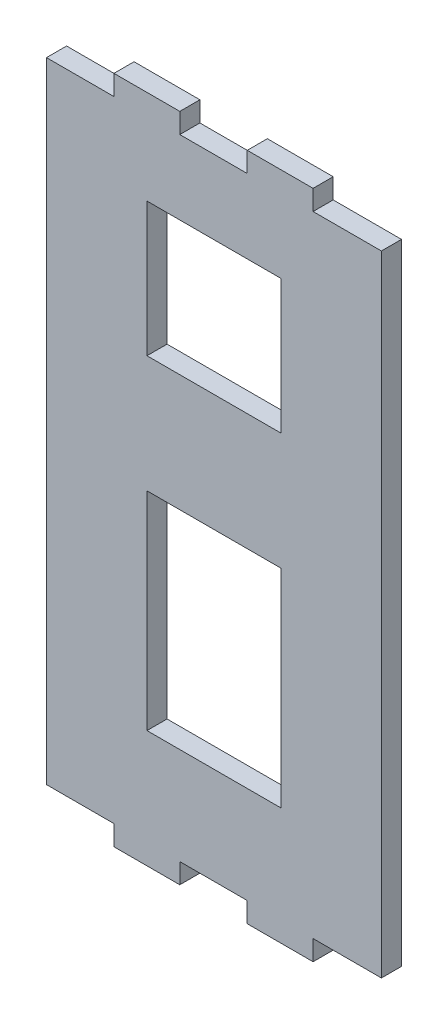
ISO-10303-21;
HEADER;
FILE_DESCRIPTION(('STEP AP214'),'2;1');
FILE_NAME('part.step','',(''),(''),'','','');
FILE_SCHEMA(('AUTOMOTIVE_DESIGN { 1 0 10303 214 1 1 1 1 }'));
ENDSEC;
DATA;
#1=APPLICATION_CONTEXT('core data for automotive mechanical design processes');
#2=APPLICATION_PROTOCOL_DEFINITION('international standard','automotive_design',2000,#1);
#3=PRODUCT_CONTEXT('',#1,'mechanical');
#4=PRODUCT('Part','Part','',(#3));
#5=PRODUCT_RELATED_PRODUCT_CATEGORY('part','',(#4));
#6=PRODUCT_DEFINITION_FORMATION('','',#4);
#7=PRODUCT_DEFINITION_CONTEXT('part definition',#1,'design');
#8=PRODUCT_DEFINITION('design','',#6,#7);
#9=PRODUCT_DEFINITION_SHAPE('','',#8);
#10=(LENGTH_UNIT() NAMED_UNIT(*) SI_UNIT(.MILLI.,.METRE.));
#11=(NAMED_UNIT(*) PLANE_ANGLE_UNIT() SI_UNIT($,.RADIAN.));
#12=(NAMED_UNIT(*) SI_UNIT($,.STERADIAN.) SOLID_ANGLE_UNIT());
#13=UNCERTAINTY_MEASURE_WITH_UNIT(LENGTH_MEASURE(1.E-05),#10,'distance_accuracy_value','');
#14=(GEOMETRIC_REPRESENTATION_CONTEXT(3) GLOBAL_UNCERTAINTY_ASSIGNED_CONTEXT((#13)) GLOBAL_UNIT_ASSIGNED_CONTEXT((#10,
#11,#12)) REPRESENTATION_CONTEXT('',''));
#15=CARTESIAN_POINT('',(0.,0.,0.));
#16=DIRECTION('',(0.,0.,1.));
#17=DIRECTION('',(1.,0.,0.));
#18=AXIS2_PLACEMENT_3D('',#15,#16,#17);
#19=CARTESIAN_POINT('',(0.,0.,3.));
#20=DIRECTION('',(0.,1.,0.));
#21=DIRECTION('',(0.,0.,1.));
#22=AXIS2_PLACEMENT_3D('',#19,#20,#21);
#23=PLANE('',#22);
#24=DIRECTION('',(1.,0.,0.));
#25=VECTOR('',#24,1.);
#26=CARTESIAN_POINT('',(0.,0.,0.));
#27=LINE('',#26,#25);
#28=CARTESIAN_POINT('',(29.970000000001,0.,0.));
#29=VERTEX_POINT('',#28);
#30=CARTESIAN_POINT('',(39.800000000001,0.,0.));
#31=VERTEX_POINT('',#30);
#32=EDGE_CURVE('E249',#29,#31,#27,.T.);
#33=ORIENTED_EDGE('',*,*,#32,.T.);
#34=DIRECTION('',(0.,0.,1.));
#35=VECTOR('',#34,1.);
#36=CARTESIAN_POINT('',(39.800000000001,0.,0.));
#37=LINE('',#36,#35);
#38=CARTESIAN_POINT('',(39.800000000001,0.,3.));
#39=VERTEX_POINT('',#38);
#40=EDGE_CURVE('E230',#31,#39,#37,.T.);
#41=ORIENTED_EDGE('',*,*,#40,.T.);
#42=DIRECTION('',(1.,0.,0.));
#43=VECTOR('',#42,1.);
#44=CARTESIAN_POINT('',(0.,0.,3.));
#45=LINE('',#44,#43);
#46=CARTESIAN_POINT('',(29.970000000001,0.,3.));
#47=VERTEX_POINT('',#46);
#48=EDGE_CURVE('E259',#47,#39,#45,.T.);
#49=ORIENTED_EDGE('',*,*,#48,.F.);
#50=DIRECTION('',(0.,0.,1.));
#51=VECTOR('',#50,1.);
#52=CARTESIAN_POINT('',(29.970000000001,0.,0.));
#53=LINE('',#52,#51);
#54=EDGE_CURVE('E389',#29,#47,#53,.T.);
#55=ORIENTED_EDGE('',*,*,#54,.F.);
#56=EDGE_LOOP('',(#33,#41,#49,#55));
#57=FACE_BOUND('',#56,.T.);
#58=ADVANCED_FACE('F33',(#57),#23,.F.);
#59=CARTESIAN_POINT('',(10.070000000001,0.,3.));
#60=VERTEX_POINT('',#59);
#61=CARTESIAN_POINT('',(19.900000000001,0.,3.));
#62=VERTEX_POINT('',#61);
#63=EDGE_CURVE('E257',#60,#62,#45,.T.);
#64=ORIENTED_EDGE('',*,*,#63,.F.);
#65=DIRECTION('',(0.,0.,1.));
#66=VECTOR('',#65,1.);
#67=CARTESIAN_POINT('',(10.070000000001,0.,0.));
#68=LINE('',#67,#66);
#69=CARTESIAN_POINT('',(10.070000000001,0.,0.));
#70=VERTEX_POINT('',#69);
#71=EDGE_CURVE('E419',#70,#60,#68,.T.);
#72=ORIENTED_EDGE('',*,*,#71,.F.);
#73=CARTESIAN_POINT('',(19.900000000001,0.,0.));
#74=VERTEX_POINT('',#73);
#75=EDGE_CURVE('E248',#70,#74,#27,.T.);
#76=ORIENTED_EDGE('',*,*,#75,.T.);
#77=DIRECTION('',(0.,0.,1.));
#78=VECTOR('',#77,1.);
#79=CARTESIAN_POINT('',(19.900000000001,0.,0.));
#80=LINE('',#79,#78);
#81=EDGE_CURVE('E386',#74,#62,#80,.T.);
#82=ORIENTED_EDGE('',*,*,#81,.T.);
#83=EDGE_LOOP('',(#64,#72,#76,#82));
#84=FACE_BOUND('',#83,.T.);
#85=ADVANCED_FACE('F463',(#84),#23,.F.);
#86=CARTESIAN_POINT('',(0.,100.,3.));
#87=DIRECTION('',(0.,-1.,0.));
#88=DIRECTION('',(0.,0.,-1.));
#89=AXIS2_PLACEMENT_3D('',#86,#87,#88);
#90=PLANE('',#89);
#91=DIRECTION('',(-1.,0.,0.));
#92=VECTOR('',#91,1.);
#93=CARTESIAN_POINT('',(0.,100.,3.));
#94=LINE('',#93,#92);
#95=CARTESIAN_POINT('',(39.8,100.,3.));
#96=VERTEX_POINT('',#95);
#97=CARTESIAN_POINT('',(29.97,100.,3.));
#98=VERTEX_POINT('',#97);
#99=EDGE_CURVE('E11',#96,#98,#94,.T.);
#100=ORIENTED_EDGE('',*,*,#99,.F.);
#101=DIRECTION('',(0.,0.,1.));
#102=VECTOR('',#101,1.);
#103=CARTESIAN_POINT('',(39.8,100.,0.));
#104=LINE('',#103,#102);
#105=CARTESIAN_POINT('',(39.8,100.,0.));
#106=VERTEX_POINT('',#105);
#107=EDGE_CURVE('E365',#106,#96,#104,.T.);
#108=ORIENTED_EDGE('',*,*,#107,.F.);
#109=DIRECTION('',(-1.,0.,0.));
#110=VECTOR('',#109,1.);
#111=CARTESIAN_POINT('',(0.,100.,0.));
#112=LINE('',#111,#110);
#113=CARTESIAN_POINT('',(29.97,100.,0.));
#114=VERTEX_POINT('',#113);
#115=EDGE_CURVE('E37',#106,#114,#112,.T.);
#116=ORIENTED_EDGE('',*,*,#115,.T.);
#117=DIRECTION('',(0.,0.,1.));
#118=VECTOR('',#117,1.);
#119=CARTESIAN_POINT('',(29.97,100.,0.));
#120=LINE('',#119,#118);
#121=EDGE_CURVE('E351',#114,#98,#120,.T.);
#122=ORIENTED_EDGE('',*,*,#121,.T.);
#123=EDGE_LOOP('',(#100,#108,#116,#122));
#124=FACE_BOUND('',#123,.T.);
#125=ADVANCED_FACE('F501',(#124),#90,.F.);
#126=CARTESIAN_POINT('',(19.9,100.,3.));
#127=VERTEX_POINT('',#126);
#128=CARTESIAN_POINT('',(10.07,100.,3.));
#129=VERTEX_POINT('',#128);
#130=EDGE_CURVE('E42',#127,#129,#94,.T.);
#131=ORIENTED_EDGE('',*,*,#130,.F.);
#132=DIRECTION('',(0.,0.,1.));
#133=VECTOR('',#132,1.);
#134=CARTESIAN_POINT('',(19.9,100.,0.));
#135=LINE('',#134,#133);
#136=CARTESIAN_POINT('',(19.9,100.,0.));
#137=VERTEX_POINT('',#136);
#138=EDGE_CURVE('E341',#137,#127,#135,.T.);
#139=ORIENTED_EDGE('',*,*,#138,.F.);
#140=CARTESIAN_POINT('',(10.07,100.,0.));
#141=VERTEX_POINT('',#140);
#142=EDGE_CURVE('E247',#137,#141,#112,.T.);
#143=ORIENTED_EDGE('',*,*,#142,.T.);
#144=DIRECTION('',(0.,0.,1.));
#145=VECTOR('',#144,1.);
#146=CARTESIAN_POINT('',(10.07,100.,0.));
#147=LINE('',#146,#145);
#148=EDGE_CURVE('E316',#141,#129,#147,.T.);
#149=ORIENTED_EDGE('',*,*,#148,.T.);
#150=EDGE_LOOP('',(#131,#139,#143,#149));
#151=FACE_BOUND('',#150,.T.);
#152=ADVANCED_FACE('F485',(#151),#90,.F.);
#153=CARTESIAN_POINT('',(0.,0.,3.));
#154=DIRECTION('',(1.,0.,0.));
#155=DIRECTION('',(0.,1.,0.));
#156=AXIS2_PLACEMENT_3D('',#153,#154,#155);
#157=PLANE('',#156);
#158=DIRECTION('',(0.,-1.,0.));
#159=VECTOR('',#158,1.);
#160=CARTESIAN_POINT('',(0.,0.,0.));
#161=LINE('',#160,#159);
#162=CARTESIAN_POINT('',(0.,97.,0.));
#163=VERTEX_POINT('',#162);
#164=CARTESIAN_POINT('',(9.88265493987723E-13,3.,0.));
#165=VERTEX_POINT('',#164);
#166=EDGE_CURVE('E252',#163,#165,#161,.T.);
#167=ORIENTED_EDGE('',*,*,#166,.T.);
#168=DIRECTION('',(0.,0.,1.));
#169=VECTOR('',#168,1.);
#170=CARTESIAN_POINT('',(9.88265493987723E-13,3.,0.));
#171=LINE('',#170,#169);
#172=CARTESIAN_POINT('',(9.88265493987723E-13,3.,3.));
#173=VERTEX_POINT('',#172);
#174=EDGE_CURVE('E416',#165,#173,#171,.T.);
#175=ORIENTED_EDGE('',*,*,#174,.T.);
#176=DIRECTION('',(0.,-1.,0.));
#177=VECTOR('',#176,1.);
#178=CARTESIAN_POINT('',(0.,0.,3.));
#179=LINE('',#178,#177);
#180=CARTESIAN_POINT('',(0.,97.,3.));
#181=VERTEX_POINT('',#180);
#182=EDGE_CURVE('E260',#181,#173,#179,.T.);
#183=ORIENTED_EDGE('',*,*,#182,.F.);
#184=DIRECTION('',(0.,0.,1.));
#185=VECTOR('',#184,1.);
#186=CARTESIAN_POINT('',(0.,97.,0.));
#187=LINE('',#186,#185);
#188=EDGE_CURVE('E327',#163,#181,#187,.T.);
#189=ORIENTED_EDGE('',*,*,#188,.F.);
#190=EDGE_LOOP('',(#167,#175,#183,#189));
#191=FACE_BOUND('',#190,.T.);
#192=ADVANCED_FACE('F35',(#191),#157,.F.);
#193=CARTESIAN_POINT('',(50.,0.,3.));
#194=DIRECTION('',(-1.,0.,0.));
#195=DIRECTION('',(0.,-1.,0.));
#196=AXIS2_PLACEMENT_3D('',#193,#194,#195);
#197=PLANE('',#196);
#198=DIRECTION('',(0.,1.,0.));
#199=VECTOR('',#198,1.);
#200=CARTESIAN_POINT('',(50.,0.,3.));
#201=LINE('',#200,#199);
#202=CARTESIAN_POINT('',(50.000000000001,3.,3.));
#203=VERTEX_POINT('',#202);
#204=CARTESIAN_POINT('',(50.,97.,3.));
#205=VERTEX_POINT('',#204);
#206=EDGE_CURVE('E238',#203,#205,#201,.T.);
#207=ORIENTED_EDGE('',*,*,#206,.F.);
#208=DIRECTION('',(0.,0.,1.));
#209=VECTOR('',#208,1.);
#210=CARTESIAN_POINT('',(50.000000000001,3.,0.));
#211=LINE('',#210,#209);
#212=CARTESIAN_POINT('',(50.000000000001,3.,0.));
#213=VERTEX_POINT('',#212);
#214=EDGE_CURVE('E223',#213,#203,#211,.T.);
#215=ORIENTED_EDGE('',*,*,#214,.F.);
#216=DIRECTION('',(0.,1.,0.));
#217=VECTOR('',#216,1.);
#218=CARTESIAN_POINT('',(50.,0.,0.));
#219=LINE('',#218,#217);
#220=CARTESIAN_POINT('',(50.,97.,0.));
#221=VERTEX_POINT('',#220);
#222=EDGE_CURVE('E236',#213,#221,#219,.T.);
#223=ORIENTED_EDGE('',*,*,#222,.T.);
#224=DIRECTION('',(0.,0.,1.));
#225=VECTOR('',#224,1.);
#226=CARTESIAN_POINT('',(50.,97.,0.));
#227=LINE('',#226,#225);
#228=EDGE_CURVE('E239',#221,#205,#227,.T.);
#229=ORIENTED_EDGE('',*,*,#228,.T.);
#230=EDGE_LOOP('',(#207,#215,#223,#229));
#231=FACE_BOUND('',#230,.T.);
#232=ADVANCED_FACE('F234',(#231),#197,.F.);
#233=CARTESIAN_POINT('',(0.,0.,3.));
#234=DIRECTION('',(0.,0.,-1.));
#235=DIRECTION('',(-1.,0.,0.));
#236=AXIS2_PLACEMENT_3D('',#233,#234,#235);
#237=PLANE('',#236);
#238=DIRECTION('',(-1.,0.,0.));
#239=VECTOR('',#238,1.);
#240=CARTESIAN_POINT('',(35.,48.4897124882247,3.));
#241=LINE('',#240,#239);
#242=CARTESIAN_POINT('',(35.,48.4897124882247,3.));
#243=VERTEX_POINT('',#242);
#244=CARTESIAN_POINT('',(15.,48.4897124882247,3.));
#245=VERTEX_POINT('',#244);
#246=EDGE_CURVE('E311',#243,#245,#241,.T.);
#247=ORIENTED_EDGE('',*,*,#246,.F.);
#248=DIRECTION('',(0.,1.,0.));
#249=VECTOR('',#248,1.);
#250=CARTESIAN_POINT('',(35.,17.4897124882247,3.));
#251=LINE('',#250,#249);
#252=CARTESIAN_POINT('',(35.,17.4897124882247,3.));
#253=VERTEX_POINT('',#252);
#254=EDGE_CURVE('E314',#253,#243,#251,.T.);
#255=ORIENTED_EDGE('',*,*,#254,.F.);
#256=DIRECTION('',(1.,0.,0.));
#257=VECTOR('',#256,1.);
#258=CARTESIAN_POINT('',(35.,17.4897124882247,3.));
#259=LINE('',#258,#257);
#260=CARTESIAN_POINT('',(15.,17.4897124882247,3.));
#261=VERTEX_POINT('',#260);
#262=EDGE_CURVE('E304',#261,#253,#259,.T.);
#263=ORIENTED_EDGE('',*,*,#262,.F.);
#264=DIRECTION('',(0.,-1.,0.));
#265=VECTOR('',#264,1.);
#266=CARTESIAN_POINT('',(15.,17.4897124882247,3.));
#267=LINE('',#266,#265);
#268=EDGE_CURVE('E308',#245,#261,#267,.T.);
#269=ORIENTED_EDGE('',*,*,#268,.F.);
#270=EDGE_LOOP('',(#247,#255,#263,#269));
#271=FACE_BOUND('',#270,.T.);
#272=DIRECTION('',(1.,0.,0.));
#273=VECTOR('',#272,1.);
#274=CARTESIAN_POINT('',(15.,65.9537447560132,3.));
#275=LINE('',#274,#273);
#276=CARTESIAN_POINT('',(15.,65.9537447560132,3.));
#277=VERTEX_POINT('',#276);
#278=CARTESIAN_POINT('',(35.,65.9537447560132,3.));
#279=VERTEX_POINT('',#278);
#280=EDGE_CURVE('E279',#277,#279,#275,.T.);
#281=ORIENTED_EDGE('',*,*,#280,.F.);
#282=DIRECTION('',(0.,-1.,0.));
#283=VECTOR('',#282,1.);
#284=CARTESIAN_POINT('',(15.,85.9537447560132,3.));
#285=LINE('',#284,#283);
#286=CARTESIAN_POINT('',(15.,85.9537447560132,3.));
#287=VERTEX_POINT('',#286);
#288=EDGE_CURVE('E282',#287,#277,#285,.T.);
#289=ORIENTED_EDGE('',*,*,#288,.F.);
#290=DIRECTION('',(-1.,0.,0.));
#291=VECTOR('',#290,1.);
#292=CARTESIAN_POINT('',(15.,85.9537447560132,3.));
#293=LINE('',#292,#291);
#294=CARTESIAN_POINT('',(35.,85.9537447560132,3.));
#295=VERTEX_POINT('',#294);
#296=EDGE_CURVE('E272',#295,#287,#293,.T.);
#297=ORIENTED_EDGE('',*,*,#296,.F.);
#298=DIRECTION('',(0.,1.,0.));
#299=VECTOR('',#298,1.);
#300=CARTESIAN_POINT('',(35.,85.9537447560132,3.));
#301=LINE('',#300,#299);
#302=EDGE_CURVE('E276',#279,#295,#301,.T.);
#303=ORIENTED_EDGE('',*,*,#302,.F.);
#304=EDGE_LOOP('',(#281,#289,#297,#303));
#305=FACE_BOUND('',#304,.T.);
#306=DIRECTION('',(-1.,0.,0.));
#307=VECTOR('',#306,1.);
#308=CARTESIAN_POINT('',(39.800000000001,3.,3.));
#309=LINE('',#308,#307);
#310=CARTESIAN_POINT('',(39.800000000001,3.,3.));
#311=VERTEX_POINT('',#310);
#312=EDGE_CURVE('E413',#203,#311,#309,.T.);
#313=ORIENTED_EDGE('',*,*,#312,.F.);
#314=ORIENTED_EDGE('',*,*,#206,.T.);
#315=DIRECTION('',(1.,0.,0.));
#316=VECTOR('',#315,1.);
#317=CARTESIAN_POINT('',(39.8,97.,3.));
#318=LINE('',#317,#316);
#319=CARTESIAN_POINT('',(39.8,97.,3.));
#320=VERTEX_POINT('',#319);
#321=EDGE_CURVE('E376',#320,#205,#318,.T.);
#322=ORIENTED_EDGE('',*,*,#321,.F.);
#323=DIRECTION('',(0.,-1.,0.));
#324=VECTOR('',#323,1.);
#325=CARTESIAN_POINT('',(39.8,100.,3.));
#326=LINE('',#325,#324);
#327=EDGE_CURVE('E380',#96,#320,#326,.T.);
#328=ORIENTED_EDGE('',*,*,#327,.F.);
#329=ORIENTED_EDGE('',*,*,#99,.T.);
#330=DIRECTION('',(0.,1.,0.));
#331=VECTOR('',#330,1.);
#332=CARTESIAN_POINT('',(29.97,100.,3.));
#333=LINE('',#332,#331);
#334=CARTESIAN_POINT('',(29.97,97.,3.));
#335=VERTEX_POINT('',#334);
#336=EDGE_CURVE('E355',#335,#98,#333,.T.);
#337=ORIENTED_EDGE('',*,*,#336,.F.);
#338=DIRECTION('',(1.,0.,0.));
#339=VECTOR('',#338,1.);
#340=CARTESIAN_POINT('',(19.9,97.,3.));
#341=LINE('',#340,#339);
#342=CARTESIAN_POINT('',(19.9,97.,3.));
#343=VERTEX_POINT('',#342);
#344=EDGE_CURVE('E359',#343,#335,#341,.T.);
#345=ORIENTED_EDGE('',*,*,#344,.F.);
#346=DIRECTION('',(0.,-1.,0.));
#347=VECTOR('',#346,1.);
#348=CARTESIAN_POINT('',(19.9,100.,3.));
#349=LINE('',#348,#347);
#350=EDGE_CURVE('E362',#127,#343,#349,.T.);
#351=ORIENTED_EDGE('',*,*,#350,.F.);
#352=ORIENTED_EDGE('',*,*,#130,.T.);
#353=DIRECTION('',(0.,1.,0.));
#354=VECTOR('',#353,1.);
#355=CARTESIAN_POINT('',(10.07,100.,3.));
#356=LINE('',#355,#354);
#357=CARTESIAN_POINT('',(10.07,97.,3.));
#358=VERTEX_POINT('',#357);
#359=EDGE_CURVE('E334',#358,#129,#356,.T.);
#360=ORIENTED_EDGE('',*,*,#359,.F.);
#361=DIRECTION('',(1.,0.,0.));
#362=VECTOR('',#361,1.);
#363=CARTESIAN_POINT('',(0.,97.,3.));
#364=LINE('',#363,#362);
#365=EDGE_CURVE('E338',#181,#358,#364,.T.);
#366=ORIENTED_EDGE('',*,*,#365,.F.);
#367=ORIENTED_EDGE('',*,*,#182,.T.);
#368=DIRECTION('',(-1.,0.,0.));
#369=VECTOR('',#368,1.);
#370=CARTESIAN_POINT('',(9.88265493987723E-13,3.,3.));
#371=LINE('',#370,#369);
#372=CARTESIAN_POINT('',(10.070000000001,3.00000000000002,3.));
#373=VERTEX_POINT('',#372);
#374=EDGE_CURVE('E425',#373,#173,#371,.T.);
#375=ORIENTED_EDGE('',*,*,#374,.F.);
#376=DIRECTION('',(0.,1.,0.));
#377=VECTOR('',#376,1.);
#378=CARTESIAN_POINT('',(10.070000000001,3.00000000000002,3.));
#379=LINE('',#378,#377);
#380=EDGE_CURVE('E428',#60,#373,#379,.T.);
#381=ORIENTED_EDGE('',*,*,#380,.F.);
#382=ORIENTED_EDGE('',*,*,#63,.T.);
#383=DIRECTION('',(0.,-1.,0.));
#384=VECTOR('',#383,1.);
#385=CARTESIAN_POINT('',(19.900000000001,3.,3.));
#386=LINE('',#385,#384);
#387=CARTESIAN_POINT('',(19.900000000001,3.,3.));
#388=VERTEX_POINT('',#387);
#389=EDGE_CURVE('E401',#388,#62,#386,.T.);
#390=ORIENTED_EDGE('',*,*,#389,.F.);
#391=DIRECTION('',(-1.,0.,0.));
#392=VECTOR('',#391,1.);
#393=CARTESIAN_POINT('',(19.900000000001,3.,3.));
#394=LINE('',#393,#392);
#395=CARTESIAN_POINT('',(29.970000000001,3.00000000000002,3.));
#396=VERTEX_POINT('',#395);
#397=EDGE_CURVE('E394',#396,#388,#394,.T.);
#398=ORIENTED_EDGE('',*,*,#397,.F.);
#399=DIRECTION('',(0.,1.,0.));
#400=VECTOR('',#399,1.);
#401=CARTESIAN_POINT('',(29.970000000001,3.00000000000002,3.));
#402=LINE('',#401,#400);
#403=EDGE_CURVE('E398',#47,#396,#402,.T.);
#404=ORIENTED_EDGE('',*,*,#403,.F.);
#405=ORIENTED_EDGE('',*,*,#48,.T.);
#406=DIRECTION('',(0.,-1.,0.));
#407=VECTOR('',#406,1.);
#408=CARTESIAN_POINT('',(39.800000000001,3.,3.));
#409=LINE('',#408,#407);
#410=EDGE_CURVE('E415',#311,#39,#409,.T.);
#411=ORIENTED_EDGE('',*,*,#410,.F.);
#412=EDGE_LOOP('',(#313,#314,#322,#328,#329,#337,#345,#351,#352,#360,#366,#367,#375,#381,#382,
#390,#398,#404,#405,#411));
#413=FACE_BOUND('',#412,.T.);
#414=ADVANCED_FACE('F439',(#271,#305,#413),#237,.F.);
#415=CARTESIAN_POINT('',(0.,0.,0.));
#416=DIRECTION('',(0.,0.,-1.));
#417=DIRECTION('',(-1.,0.,0.));
#418=AXIS2_PLACEMENT_3D('',#415,#416,#417);
#419=PLANE('',#418);
#420=ORIENTED_EDGE('',*,*,#222,.F.);
#421=DIRECTION('',(-1.,0.,0.));
#422=VECTOR('',#421,1.);
#423=CARTESIAN_POINT('',(39.800000000001,3.,0.));
#424=LINE('',#423,#422);
#425=CARTESIAN_POINT('',(39.800000000001,3.,0.));
#426=VERTEX_POINT('',#425);
#427=EDGE_CURVE('E219',#213,#426,#424,.T.);
#428=ORIENTED_EDGE('',*,*,#427,.T.);
#429=DIRECTION('',(0.,-1.,0.));
#430=VECTOR('',#429,1.);
#431=CARTESIAN_POINT('',(39.800000000001,3.,0.));
#432=LINE('',#431,#430);
#433=EDGE_CURVE('E231',#426,#31,#432,.T.);
#434=ORIENTED_EDGE('',*,*,#433,.T.);
#435=ORIENTED_EDGE('',*,*,#32,.F.);
#436=DIRECTION('',(0.,1.,0.));
#437=VECTOR('',#436,1.);
#438=CARTESIAN_POINT('',(29.970000000001,3.00000000000002,0.));
#439=LINE('',#438,#437);
#440=CARTESIAN_POINT('',(29.970000000001,3.00000000000002,0.));
#441=VERTEX_POINT('',#440);
#442=EDGE_CURVE('E405',#29,#441,#439,.T.);
#443=ORIENTED_EDGE('',*,*,#442,.T.);
#444=DIRECTION('',(-1.,0.,0.));
#445=VECTOR('',#444,1.);
#446=CARTESIAN_POINT('',(19.900000000001,3.,0.));
#447=LINE('',#446,#445);
#448=CARTESIAN_POINT('',(19.900000000001,3.,0.));
#449=VERTEX_POINT('',#448);
#450=EDGE_CURVE('E58',#441,#449,#447,.T.);
#451=ORIENTED_EDGE('',*,*,#450,.T.);
#452=DIRECTION('',(0.,-1.,0.));
#453=VECTOR('',#452,1.);
#454=CARTESIAN_POINT('',(19.900000000001,3.,0.));
#455=LINE('',#454,#453);
#456=EDGE_CURVE('E397',#449,#74,#455,.T.);
#457=ORIENTED_EDGE('',*,*,#456,.T.);
#458=ORIENTED_EDGE('',*,*,#75,.F.);
#459=DIRECTION('',(0.,1.,0.));
#460=VECTOR('',#459,1.);
#461=CARTESIAN_POINT('',(10.070000000001,3.00000000000002,0.));
#462=LINE('',#461,#460);
#463=CARTESIAN_POINT('',(10.070000000001,3.00000000000002,0.));
#464=VERTEX_POINT('',#463);
#465=EDGE_CURVE('E427',#70,#464,#462,.T.);
#466=ORIENTED_EDGE('',*,*,#465,.T.);
#467=DIRECTION('',(-1.,0.,0.));
#468=VECTOR('',#467,1.);
#469=CARTESIAN_POINT('',(9.88265493987723E-13,3.,0.));
#470=LINE('',#469,#468);
#471=EDGE_CURVE('E50',#464,#165,#470,.T.);
#472=ORIENTED_EDGE('',*,*,#471,.T.);
#473=ORIENTED_EDGE('',*,*,#166,.F.);
#474=DIRECTION('',(1.,0.,0.));
#475=VECTOR('',#474,1.);
#476=CARTESIAN_POINT('',(0.,97.,0.));
#477=LINE('',#476,#475);
#478=CARTESIAN_POINT('',(10.07,97.,0.));
#479=VERTEX_POINT('',#478);
#480=EDGE_CURVE('E337',#163,#479,#477,.T.);
#481=ORIENTED_EDGE('',*,*,#480,.T.);
#482=DIRECTION('',(0.,1.,0.));
#483=VECTOR('',#482,1.);
#484=CARTESIAN_POINT('',(10.07,100.,0.));
#485=LINE('',#484,#483);
#486=EDGE_CURVE('E330',#479,#141,#485,.T.);
#487=ORIENTED_EDGE('',*,*,#486,.T.);
#488=ORIENTED_EDGE('',*,*,#142,.F.);
#489=DIRECTION('',(0.,-1.,0.));
#490=VECTOR('',#489,1.);
#491=CARTESIAN_POINT('',(19.9,100.,0.));
#492=LINE('',#491,#490);
#493=CARTESIAN_POINT('',(19.9,97.,0.));
#494=VERTEX_POINT('',#493);
#495=EDGE_CURVE('E358',#137,#494,#492,.T.);
#496=ORIENTED_EDGE('',*,*,#495,.T.);
#497=DIRECTION('',(1.,0.,0.));
#498=VECTOR('',#497,1.);
#499=CARTESIAN_POINT('',(19.9,97.,0.));
#500=LINE('',#499,#498);
#501=CARTESIAN_POINT('',(29.97,97.,0.));
#502=VERTEX_POINT('',#501);
#503=EDGE_CURVE('E368',#494,#502,#500,.T.);
#504=ORIENTED_EDGE('',*,*,#503,.T.);
#505=DIRECTION('',(0.,1.,0.));
#506=VECTOR('',#505,1.);
#507=CARTESIAN_POINT('',(29.97,100.,0.));
#508=LINE('',#507,#506);
#509=EDGE_CURVE('E349',#502,#114,#508,.T.);
#510=ORIENTED_EDGE('',*,*,#509,.T.);
#511=ORIENTED_EDGE('',*,*,#115,.F.);
#512=DIRECTION('',(0.,-1.,0.));
#513=VECTOR('',#512,1.);
#514=CARTESIAN_POINT('',(39.8,100.,0.));
#515=LINE('',#514,#513);
#516=CARTESIAN_POINT('',(39.8,97.,0.));
#517=VERTEX_POINT('',#516);
#518=EDGE_CURVE('E379',#106,#517,#515,.T.);
#519=ORIENTED_EDGE('',*,*,#518,.T.);
#520=DIRECTION('',(1.,0.,0.));
#521=VECTOR('',#520,1.);
#522=CARTESIAN_POINT('',(39.8,97.,0.));
#523=LINE('',#522,#521);
#524=EDGE_CURVE('E245',#517,#221,#523,.T.);
#525=ORIENTED_EDGE('',*,*,#524,.T.);
#526=EDGE_LOOP('',(#420,#428,#434,#435,#443,#451,#457,#458,#466,#472,#473,#481,#487,#488,#496,
#504,#510,#511,#519,#525));
#527=FACE_BOUND('',#526,.T.);
#528=DIRECTION('',(0.,1.,0.));
#529=VECTOR('',#528,1.);
#530=CARTESIAN_POINT('',(35.,17.4897124882247,0.));
#531=LINE('',#530,#529);
#532=CARTESIAN_POINT('',(35.,17.4897124882247,0.));
#533=VERTEX_POINT('',#532);
#534=CARTESIAN_POINT('',(35.,48.4897124882247,0.));
#535=VERTEX_POINT('',#534);
#536=EDGE_CURVE('E307',#533,#535,#531,.T.);
#537=ORIENTED_EDGE('',*,*,#536,.T.);
#538=DIRECTION('',(-1.,0.,0.));
#539=VECTOR('',#538,1.);
#540=CARTESIAN_POINT('',(35.,48.4897124882247,0.));
#541=LINE('',#540,#539);
#542=CARTESIAN_POINT('',(15.,48.4897124882247,0.));
#543=VERTEX_POINT('',#542);
#544=EDGE_CURVE('E322',#535,#543,#541,.T.);
#545=ORIENTED_EDGE('',*,*,#544,.T.);
#546=DIRECTION('',(0.,-1.,0.));
#547=VECTOR('',#546,1.);
#548=CARTESIAN_POINT('',(15.,17.4897124882247,0.));
#549=LINE('',#548,#547);
#550=CARTESIAN_POINT('',(15.,17.4897124882247,0.));
#551=VERTEX_POINT('',#550);
#552=EDGE_CURVE('E319',#543,#551,#549,.T.);
#553=ORIENTED_EDGE('',*,*,#552,.T.);
#554=DIRECTION('',(1.,0.,0.));
#555=VECTOR('',#554,1.);
#556=CARTESIAN_POINT('',(35.,17.4897124882247,0.));
#557=LINE('',#556,#555);
#558=EDGE_CURVE('E299',#551,#533,#557,.T.);
#559=ORIENTED_EDGE('',*,*,#558,.T.);
#560=EDGE_LOOP('',(#537,#545,#553,#559));
#561=FACE_BOUND('',#560,.T.);
#562=DIRECTION('',(0.,-1.,0.));
#563=VECTOR('',#562,1.);
#564=CARTESIAN_POINT('',(15.,85.9537447560132,0.));
#565=LINE('',#564,#563);
#566=CARTESIAN_POINT('',(15.,85.9537447560132,0.));
#567=VERTEX_POINT('',#566);
#568=CARTESIAN_POINT('',(15.,65.9537447560132,0.));
#569=VERTEX_POINT('',#568);
#570=EDGE_CURVE('E275',#567,#569,#565,.T.);
#571=ORIENTED_EDGE('',*,*,#570,.T.);
#572=DIRECTION('',(1.,0.,0.));
#573=VECTOR('',#572,1.);
#574=CARTESIAN_POINT('',(15.,65.9537447560132,0.));
#575=LINE('',#574,#573);
#576=CARTESIAN_POINT('',(35.,65.9537447560132,0.));
#577=VERTEX_POINT('',#576);
#578=EDGE_CURVE('E290',#569,#577,#575,.T.);
#579=ORIENTED_EDGE('',*,*,#578,.T.);
#580=DIRECTION('',(0.,1.,0.));
#581=VECTOR('',#580,1.);
#582=CARTESIAN_POINT('',(35.,85.9537447560132,0.));
#583=LINE('',#582,#581);
#584=CARTESIAN_POINT('',(35.,85.9537447560132,0.));
#585=VERTEX_POINT('',#584);
#586=EDGE_CURVE('E287',#577,#585,#583,.T.);
#587=ORIENTED_EDGE('',*,*,#586,.T.);
#588=DIRECTION('',(-1.,0.,0.));
#589=VECTOR('',#588,1.);
#590=CARTESIAN_POINT('',(15.,85.9537447560132,0.));
#591=LINE('',#590,#589);
#592=EDGE_CURVE('E267',#585,#567,#591,.T.);
#593=ORIENTED_EDGE('',*,*,#592,.T.);
#594=EDGE_LOOP('',(#571,#579,#587,#593));
#595=FACE_BOUND('',#594,.T.);
#596=ADVANCED_FACE('F241',(#527,#561,#595),#419,.T.);
#597=CARTESIAN_POINT('',(15.,85.9537447560132,0.));
#598=DIRECTION('',(-1.,0.,0.));
#599=DIRECTION('',(0.,-1.,0.));
#600=AXIS2_PLACEMENT_3D('',#597,#598,#599);
#601=PLANE('',#600);
#602=ORIENTED_EDGE('',*,*,#288,.T.);
#603=DIRECTION('',(0.,0.,1.));
#604=VECTOR('',#603,1.);
#605=CARTESIAN_POINT('',(15.,65.9537447560132,0.));
#606=LINE('',#605,#604);
#607=EDGE_CURVE('E263',#569,#277,#606,.T.);
#608=ORIENTED_EDGE('',*,*,#607,.F.);
#609=ORIENTED_EDGE('',*,*,#570,.F.);
#610=DIRECTION('',(0.,0.,1.));
#611=VECTOR('',#610,1.);
#612=CARTESIAN_POINT('',(15.,85.9537447560132,0.));
#613=LINE('',#612,#611);
#614=EDGE_CURVE('E254',#567,#287,#613,.T.);
#615=ORIENTED_EDGE('',*,*,#614,.T.);
#616=EDGE_LOOP('',(#602,#608,#609,#615));
#617=FACE_BOUND('',#616,.T.);
#618=ADVANCED_FACE('F525',(#617),#601,.F.);
#619=CARTESIAN_POINT('',(15.,85.9537447560132,0.));
#620=DIRECTION('',(0.,1.,0.));
#621=DIRECTION('',(0.,0.,1.));
#622=AXIS2_PLACEMENT_3D('',#619,#620,#621);
#623=PLANE('',#622);
#624=ORIENTED_EDGE('',*,*,#296,.T.);
#625=ORIENTED_EDGE('',*,*,#614,.F.);
#626=ORIENTED_EDGE('',*,*,#592,.F.);
#627=DIRECTION('',(0.,0.,1.));
#628=VECTOR('',#627,1.);
#629=CARTESIAN_POINT('',(35.,85.9537447560132,0.));
#630=LINE('',#629,#628);
#631=EDGE_CURVE('E269',#585,#295,#630,.T.);
#632=ORIENTED_EDGE('',*,*,#631,.T.);
#633=EDGE_LOOP('',(#624,#625,#626,#632));
#634=FACE_BOUND('',#633,.T.);
#635=ADVANCED_FACE('F531',(#634),#623,.F.);
#636=CARTESIAN_POINT('',(35.,85.9537447560132,0.));
#637=DIRECTION('',(1.,0.,0.));
#638=DIRECTION('',(0.,0.,-1.));
#639=AXIS2_PLACEMENT_3D('',#636,#637,#638);
#640=PLANE('',#639);
#641=ORIENTED_EDGE('',*,*,#302,.T.);
#642=ORIENTED_EDGE('',*,*,#631,.F.);
#643=ORIENTED_EDGE('',*,*,#586,.F.);
#644=DIRECTION('',(0.,0.,1.));
#645=VECTOR('',#644,1.);
#646=CARTESIAN_POINT('',(35.,65.9537447560132,0.));
#647=LINE('',#646,#645);
#648=EDGE_CURVE('E266',#577,#279,#647,.T.);
#649=ORIENTED_EDGE('',*,*,#648,.T.);
#650=EDGE_LOOP('',(#641,#642,#643,#649));
#651=FACE_BOUND('',#650,.T.);
#652=ADVANCED_FACE('F537',(#651),#640,.F.);
#653=CARTESIAN_POINT('',(15.,65.9537447560132,0.));
#654=DIRECTION('',(0.,-1.,0.));
#655=DIRECTION('',(0.,0.,-1.));
#656=AXIS2_PLACEMENT_3D('',#653,#654,#655);
#657=PLANE('',#656);
#658=ORIENTED_EDGE('',*,*,#280,.T.);
#659=ORIENTED_EDGE('',*,*,#648,.F.);
#660=ORIENTED_EDGE('',*,*,#578,.F.);
#661=ORIENTED_EDGE('',*,*,#607,.T.);
#662=EDGE_LOOP('',(#658,#659,#660,#661));
#663=FACE_BOUND('',#662,.T.);
#664=ADVANCED_FACE('F533',(#663),#657,.F.);
#665=CARTESIAN_POINT('',(35.,17.4897124882247,0.));
#666=DIRECTION('',(1.,0.,0.));
#667=DIRECTION('',(0.,0.,-1.));
#668=AXIS2_PLACEMENT_3D('',#665,#666,#667);
#669=PLANE('',#668);
#670=ORIENTED_EDGE('',*,*,#254,.T.);
#671=DIRECTION('',(0.,0.,1.));
#672=VECTOR('',#671,1.);
#673=CARTESIAN_POINT('',(35.,48.4897124882247,0.));
#674=LINE('',#673,#672);
#675=EDGE_CURVE('E295',#535,#243,#674,.T.);
#676=ORIENTED_EDGE('',*,*,#675,.F.);
#677=ORIENTED_EDGE('',*,*,#536,.F.);
#678=DIRECTION('',(0.,0.,1.));
#679=VECTOR('',#678,1.);
#680=CARTESIAN_POINT('',(35.,17.4897124882247,0.));
#681=LINE('',#680,#679);
#682=EDGE_CURVE('E284',#533,#253,#681,.T.);
#683=ORIENTED_EDGE('',*,*,#682,.T.);
#684=EDGE_LOOP('',(#670,#676,#677,#683));
#685=FACE_BOUND('',#684,.T.);
#686=ADVANCED_FACE('F536',(#685),#669,.F.);
#687=CARTESIAN_POINT('',(35.,17.4897124882247,0.));
#688=DIRECTION('',(0.,-1.,0.));
#689=DIRECTION('',(1.,0.,0.));
#690=AXIS2_PLACEMENT_3D('',#687,#688,#689);
#691=PLANE('',#690);
#692=ORIENTED_EDGE('',*,*,#262,.T.);
#693=ORIENTED_EDGE('',*,*,#682,.F.);
#694=ORIENTED_EDGE('',*,*,#558,.F.);
#695=DIRECTION('',(0.,0.,1.));
#696=VECTOR('',#695,1.);
#697=CARTESIAN_POINT('',(15.,17.4897124882247,0.));
#698=LINE('',#697,#696);
#699=EDGE_CURVE('E301',#551,#261,#698,.T.);
#700=ORIENTED_EDGE('',*,*,#699,.T.);
#701=EDGE_LOOP('',(#692,#693,#694,#700));
#702=FACE_BOUND('',#701,.T.);
#703=ADVANCED_FACE('F547',(#702),#691,.F.);
#704=CARTESIAN_POINT('',(15.,17.4897124882247,0.));
#705=DIRECTION('',(-1.,0.,0.));
#706=DIRECTION('',(0.,0.,1.));
#707=AXIS2_PLACEMENT_3D('',#704,#705,#706);
#708=PLANE('',#707);
#709=ORIENTED_EDGE('',*,*,#268,.T.);
#710=ORIENTED_EDGE('',*,*,#699,.F.);
#711=ORIENTED_EDGE('',*,*,#552,.F.);
#712=DIRECTION('',(0.,0.,1.));
#713=VECTOR('',#712,1.);
#714=CARTESIAN_POINT('',(15.,48.4897124882247,0.));
#715=LINE('',#714,#713);
#716=EDGE_CURVE('E298',#543,#245,#715,.T.);
#717=ORIENTED_EDGE('',*,*,#716,.T.);
#718=EDGE_LOOP('',(#709,#710,#711,#717));
#719=FACE_BOUND('',#718,.T.);
#720=ADVANCED_FACE('F552',(#719),#708,.F.);
#721=CARTESIAN_POINT('',(35.,48.4897124882247,0.));
#722=DIRECTION('',(0.,1.,0.));
#723=DIRECTION('',(-1.,0.,0.));
#724=AXIS2_PLACEMENT_3D('',#721,#722,#723);
#725=PLANE('',#724);
#726=ORIENTED_EDGE('',*,*,#246,.T.);
#727=ORIENTED_EDGE('',*,*,#716,.F.);
#728=ORIENTED_EDGE('',*,*,#544,.F.);
#729=ORIENTED_EDGE('',*,*,#675,.T.);
#730=EDGE_LOOP('',(#726,#727,#728,#729));
#731=FACE_BOUND('',#730,.T.);
#732=ADVANCED_FACE('F549',(#731),#725,.F.);
#733=CARTESIAN_POINT('',(10.07,100.,0.));
#734=DIRECTION('',(1.,0.,0.));
#735=DIRECTION('',(0.,1.,0.));
#736=AXIS2_PLACEMENT_3D('',#733,#734,#735);
#737=PLANE('',#736);
#738=ORIENTED_EDGE('',*,*,#359,.T.);
#739=ORIENTED_EDGE('',*,*,#148,.F.);
#740=ORIENTED_EDGE('',*,*,#486,.F.);
#741=DIRECTION('',(0.,0.,1.));
#742=VECTOR('',#741,1.);
#743=CARTESIAN_POINT('',(10.07,97.,0.));
#744=LINE('',#743,#742);
#745=EDGE_CURVE('E329',#479,#358,#744,.T.);
#746=ORIENTED_EDGE('',*,*,#745,.T.);
#747=EDGE_LOOP('',(#738,#739,#740,#746));
#748=FACE_BOUND('',#747,.T.);
#749=ADVANCED_FACE('F482',(#748),#737,.F.);
#750=CARTESIAN_POINT('',(0.,97.,0.));
#751=DIRECTION('',(0.,-1.,0.));
#752=DIRECTION('',(0.,0.,-1.));
#753=AXIS2_PLACEMENT_3D('',#750,#751,#752);
#754=PLANE('',#753);
#755=ORIENTED_EDGE('',*,*,#365,.T.);
#756=ORIENTED_EDGE('',*,*,#745,.F.);
#757=ORIENTED_EDGE('',*,*,#480,.F.);
#758=ORIENTED_EDGE('',*,*,#188,.T.);
#759=EDGE_LOOP('',(#755,#756,#757,#758));
#760=FACE_BOUND('',#759,.T.);
#761=ADVANCED_FACE('F478',(#760),#754,.F.);
#762=CARTESIAN_POINT('',(19.9,100.,0.));
#763=DIRECTION('',(-1.,0.,0.));
#764=DIRECTION('',(0.,-1.,0.));
#765=AXIS2_PLACEMENT_3D('',#762,#763,#764);
#766=PLANE('',#765);
#767=ORIENTED_EDGE('',*,*,#350,.T.);
#768=DIRECTION('',(0.,0.,1.));
#769=VECTOR('',#768,1.);
#770=CARTESIAN_POINT('',(19.9,97.,0.));
#771=LINE('',#770,#769);
#772=EDGE_CURVE('E346',#494,#343,#771,.T.);
#773=ORIENTED_EDGE('',*,*,#772,.F.);
#774=ORIENTED_EDGE('',*,*,#495,.F.);
#775=ORIENTED_EDGE('',*,*,#138,.T.);
#776=EDGE_LOOP('',(#767,#773,#774,#775));
#777=FACE_BOUND('',#776,.T.);
#778=ADVANCED_FACE('F489',(#777),#766,.F.);
#779=CARTESIAN_POINT('',(29.97,100.,0.));
#780=DIRECTION('',(1.,0.,0.));
#781=DIRECTION('',(0.,1.,0.));
#782=AXIS2_PLACEMENT_3D('',#779,#780,#781);
#783=PLANE('',#782);
#784=ORIENTED_EDGE('',*,*,#336,.T.);
#785=ORIENTED_EDGE('',*,*,#121,.F.);
#786=ORIENTED_EDGE('',*,*,#509,.F.);
#787=DIRECTION('',(0.,0.,1.));
#788=VECTOR('',#787,1.);
#789=CARTESIAN_POINT('',(29.97,97.,0.));
#790=LINE('',#789,#788);
#791=EDGE_CURVE('E348',#502,#335,#790,.T.);
#792=ORIENTED_EDGE('',*,*,#791,.T.);
#793=EDGE_LOOP('',(#784,#785,#786,#792));
#794=FACE_BOUND('',#793,.T.);
#795=ADVANCED_FACE('F499',(#794),#783,.F.);
#796=CARTESIAN_POINT('',(19.9,97.,0.));
#797=DIRECTION('',(0.,-1.,0.));
#798=DIRECTION('',(0.,0.,-1.));
#799=AXIS2_PLACEMENT_3D('',#796,#797,#798);
#800=PLANE('',#799);
#801=ORIENTED_EDGE('',*,*,#344,.T.);
#802=ORIENTED_EDGE('',*,*,#791,.F.);
#803=ORIENTED_EDGE('',*,*,#503,.F.);
#804=ORIENTED_EDGE('',*,*,#772,.T.);
#805=EDGE_LOOP('',(#801,#802,#803,#804));
#806=FACE_BOUND('',#805,.T.);
#807=ADVANCED_FACE('F494',(#806),#800,.F.);
#808=CARTESIAN_POINT('',(39.8,100.,0.));
#809=DIRECTION('',(-1.,0.,0.));
#810=DIRECTION('',(0.,-1.,0.));
#811=AXIS2_PLACEMENT_3D('',#808,#809,#810);
#812=PLANE('',#811);
#813=ORIENTED_EDGE('',*,*,#327,.T.);
#814=DIRECTION('',(0.,0.,1.));
#815=VECTOR('',#814,1.);
#816=CARTESIAN_POINT('',(39.8,97.,0.));
#817=LINE('',#816,#815);
#818=EDGE_CURVE('E373',#517,#320,#817,.T.);
#819=ORIENTED_EDGE('',*,*,#818,.F.);
#820=ORIENTED_EDGE('',*,*,#518,.F.);
#821=ORIENTED_EDGE('',*,*,#107,.T.);
#822=EDGE_LOOP('',(#813,#819,#820,#821));
#823=FACE_BOUND('',#822,.T.);
#824=ADVANCED_FACE('F504',(#823),#812,.F.);
#825=CARTESIAN_POINT('',(39.8,97.,0.));
#826=DIRECTION('',(0.,-1.,0.));
#827=DIRECTION('',(0.,0.,-1.));
#828=AXIS2_PLACEMENT_3D('',#825,#826,#827);
#829=PLANE('',#828);
#830=ORIENTED_EDGE('',*,*,#321,.T.);
#831=ORIENTED_EDGE('',*,*,#228,.F.);
#832=ORIENTED_EDGE('',*,*,#524,.F.);
#833=ORIENTED_EDGE('',*,*,#818,.T.);
#834=EDGE_LOOP('',(#830,#831,#832,#833));
#835=FACE_BOUND('',#834,.T.);
#836=ADVANCED_FACE('F435',(#835),#829,.F.);
#837=CARTESIAN_POINT('',(19.900000000001,3.,0.));
#838=DIRECTION('',(-1.,0.,0.));
#839=DIRECTION('',(0.,-1.,0.));
#840=AXIS2_PLACEMENT_3D('',#837,#838,#839);
#841=PLANE('',#840);
#842=ORIENTED_EDGE('',*,*,#389,.T.);
#843=ORIENTED_EDGE('',*,*,#81,.F.);
#844=ORIENTED_EDGE('',*,*,#456,.F.);
#845=DIRECTION('',(0.,0.,1.));
#846=VECTOR('',#845,1.);
#847=CARTESIAN_POINT('',(19.900000000001,3.,0.));
#848=LINE('',#847,#846);
#849=EDGE_CURVE('E383',#449,#388,#848,.T.);
#850=ORIENTED_EDGE('',*,*,#849,.T.);
#851=EDGE_LOOP('',(#842,#843,#844,#850));
#852=FACE_BOUND('',#851,.T.);
#853=ADVANCED_FACE('F461',(#852),#841,.F.);
#854=CARTESIAN_POINT('',(19.900000000001,3.,0.));
#855=DIRECTION('',(0.,1.,0.));
#856=DIRECTION('',(-1.,0.,0.));
#857=AXIS2_PLACEMENT_3D('',#854,#855,#856);
#858=PLANE('',#857);
#859=ORIENTED_EDGE('',*,*,#397,.T.);
#860=ORIENTED_EDGE('',*,*,#849,.F.);
#861=ORIENTED_EDGE('',*,*,#450,.F.);
#862=DIRECTION('',(0.,0.,1.));
#863=VECTOR('',#862,1.);
#864=CARTESIAN_POINT('',(29.970000000001,3.00000000000002,0.));
#865=LINE('',#864,#863);
#866=EDGE_CURVE('E391',#441,#396,#865,.T.);
#867=ORIENTED_EDGE('',*,*,#866,.T.);
#868=EDGE_LOOP('',(#859,#860,#861,#867));
#869=FACE_BOUND('',#868,.T.);
#870=ADVANCED_FACE('F454',(#869),#858,.F.);
#871=CARTESIAN_POINT('',(29.970000000001,3.00000000000002,0.));
#872=DIRECTION('',(1.,0.,0.));
#873=DIRECTION('',(0.,0.,-1.));
#874=AXIS2_PLACEMENT_3D('',#871,#872,#873);
#875=PLANE('',#874);
#876=ORIENTED_EDGE('',*,*,#403,.T.);
#877=ORIENTED_EDGE('',*,*,#866,.F.);
#878=ORIENTED_EDGE('',*,*,#442,.F.);
#879=ORIENTED_EDGE('',*,*,#54,.T.);
#880=EDGE_LOOP('',(#876,#877,#878,#879));
#881=FACE_BOUND('',#880,.T.);
#882=ADVANCED_FACE('F452',(#881),#875,.F.);
#883=CARTESIAN_POINT('',(39.800000000001,3.,0.));
#884=DIRECTION('',(-1.,0.,0.));
#885=DIRECTION('',(0.,-1.,0.));
#886=AXIS2_PLACEMENT_3D('',#883,#884,#885);
#887=PLANE('',#886);
#888=ORIENTED_EDGE('',*,*,#410,.T.);
#889=ORIENTED_EDGE('',*,*,#40,.F.);
#890=ORIENTED_EDGE('',*,*,#433,.F.);
#891=DIRECTION('',(0.,0.,1.));
#892=VECTOR('',#891,1.);
#893=CARTESIAN_POINT('',(39.800000000001,3.,0.));
#894=LINE('',#893,#892);
#895=EDGE_CURVE('E225',#426,#311,#894,.T.);
#896=ORIENTED_EDGE('',*,*,#895,.T.);
#897=EDGE_LOOP('',(#888,#889,#890,#896));
#898=FACE_BOUND('',#897,.T.);
#899=ADVANCED_FACE('F446',(#898),#887,.F.);
#900=CARTESIAN_POINT('',(39.800000000001,3.,0.));
#901=DIRECTION('',(0.,1.,0.));
#902=DIRECTION('',(-1.,0.,0.));
#903=AXIS2_PLACEMENT_3D('',#900,#901,#902);
#904=PLANE('',#903);
#905=ORIENTED_EDGE('',*,*,#312,.T.);
#906=ORIENTED_EDGE('',*,*,#895,.F.);
#907=ORIENTED_EDGE('',*,*,#427,.F.);
#908=ORIENTED_EDGE('',*,*,#214,.T.);
#909=EDGE_LOOP('',(#905,#906,#907,#908));
#910=FACE_BOUND('',#909,.T.);
#911=ADVANCED_FACE('F222',(#910),#904,.F.);
#912=CARTESIAN_POINT('',(9.88265493987723E-13,3.,0.));
#913=DIRECTION('',(0.,1.,0.));
#914=DIRECTION('',(-1.,0.,0.));
#915=AXIS2_PLACEMENT_3D('',#912,#913,#914);
#916=PLANE('',#915);
#917=ORIENTED_EDGE('',*,*,#374,.T.);
#918=ORIENTED_EDGE('',*,*,#174,.F.);
#919=ORIENTED_EDGE('',*,*,#471,.F.);
#920=DIRECTION('',(0.,0.,1.));
#921=VECTOR('',#920,1.);
#922=CARTESIAN_POINT('',(10.070000000001,3.00000000000002,0.));
#923=LINE('',#922,#921);
#924=EDGE_CURVE('E421',#464,#373,#923,.T.);
#925=ORIENTED_EDGE('',*,*,#924,.T.);
#926=EDGE_LOOP('',(#917,#918,#919,#925));
#927=FACE_BOUND('',#926,.T.);
#928=ADVANCED_FACE('F470',(#927),#916,.F.);
#929=CARTESIAN_POINT('',(10.070000000001,3.00000000000002,0.));
#930=DIRECTION('',(1.,0.,0.));
#931=DIRECTION('',(0.,1.,0.));
#932=AXIS2_PLACEMENT_3D('',#929,#930,#931);
#933=PLANE('',#932);
#934=ORIENTED_EDGE('',*,*,#380,.T.);
#935=ORIENTED_EDGE('',*,*,#924,.F.);
#936=ORIENTED_EDGE('',*,*,#465,.F.);
#937=ORIENTED_EDGE('',*,*,#71,.T.);
#938=EDGE_LOOP('',(#934,#935,#936,#937));
#939=FACE_BOUND('',#938,.T.);
#940=ADVANCED_FACE('F468',(#939),#933,.F.);
#941=CLOSED_SHELL('',(#58,#85,#125,#152,#192,#232,#414,#596,#618,#635,#652,#664,#686,#703,#720,
#732,#749,#761,#778,#795,#807,#824,#836,#853,#870,#882,#899,#911,#928,#940));
#942=MANIFOLD_SOLID_BREP('B2',#941);
#943=ADVANCED_BREP_SHAPE_REPRESENTATION('',(#18,#942),#14);
#944=SHAPE_DEFINITION_REPRESENTATION(#9,#943);
ENDSEC;
END-ISO-10303-21;
